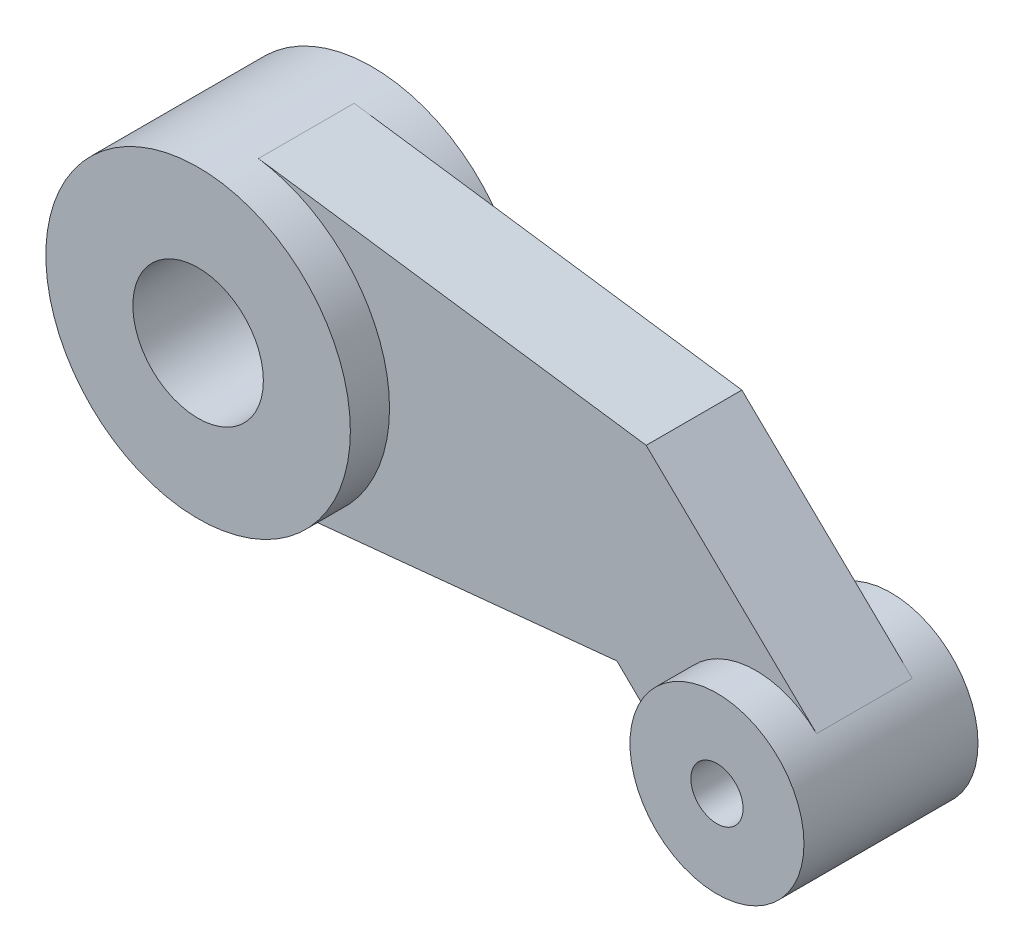
ISO-10303-21;
HEADER;
FILE_DESCRIPTION(('STEP AP214'),'2;1');
FILE_NAME('part.step','',(''),(''),'','','');
FILE_SCHEMA(('AUTOMOTIVE_DESIGN { 1 0 10303 214 1 1 1 1 }'));
ENDSEC;
DATA;
#1=APPLICATION_CONTEXT('core data for automotive mechanical design processes');
#2=APPLICATION_PROTOCOL_DEFINITION('international standard','automotive_design',2000,#1);
#3=PRODUCT_CONTEXT('',#1,'mechanical');
#4=PRODUCT('Part','Part','',(#3));
#5=PRODUCT_RELATED_PRODUCT_CATEGORY('part','',(#4));
#6=PRODUCT_DEFINITION_FORMATION('','',#4);
#7=PRODUCT_DEFINITION_CONTEXT('part definition',#1,'design');
#8=PRODUCT_DEFINITION('design','',#6,#7);
#9=PRODUCT_DEFINITION_SHAPE('','',#8);
#10=(LENGTH_UNIT() NAMED_UNIT(*) SI_UNIT(.MILLI.,.METRE.));
#11=(NAMED_UNIT(*) PLANE_ANGLE_UNIT() SI_UNIT($,.RADIAN.));
#12=(NAMED_UNIT(*) SI_UNIT($,.STERADIAN.) SOLID_ANGLE_UNIT());
#13=UNCERTAINTY_MEASURE_WITH_UNIT(LENGTH_MEASURE(1.E-05),#10,'distance_accuracy_value','');
#14=(GEOMETRIC_REPRESENTATION_CONTEXT(3) GLOBAL_UNCERTAINTY_ASSIGNED_CONTEXT((#13)) GLOBAL_UNIT_ASSIGNED_CONTEXT((#10,
#11,#12)) REPRESENTATION_CONTEXT('',''));
#15=CARTESIAN_POINT('',(0.,0.,0.));
#16=DIRECTION('',(0.,0.,1.));
#17=DIRECTION('',(1.,0.,0.));
#18=AXIS2_PLACEMENT_3D('',#15,#16,#17);
#19=CARTESIAN_POINT('',(15.239092250562,15.6204676908486,11.));
#20=DIRECTION('',(0.698314732770874,0.715790845146222,0.));
#21=DIRECTION('',(-0.715790845146222,0.698314732770874,0.));
#22=AXIS2_PLACEMENT_3D('',#19,#20,#21);
#23=PLANE('',#22);
#24=DIRECTION('',(0.715790845146222,-0.698314732770874,0.));
#25=VECTOR('',#24,1.);
#26=CARTESIAN_POINT('',(15.239092250562,15.6204676908486,0.));
#27=LINE('',#26,#25);
#28=CARTESIAN_POINT('',(43.6323840804154,-12.0795987896038,0.));
#29=VERTEX_POINT('',#28);
#30=CARTESIAN_POINT('',(50.2732587714625,-18.558335793143,0.));
#31=VERTEX_POINT('',#30);
#32=EDGE_CURVE('E126',#29,#31,#27,.T.);
#33=ORIENTED_EDGE('',*,*,#32,.T.);
#34=DIRECTION('',(0.,0.,-1.));
#35=VECTOR('',#34,1.);
#36=CARTESIAN_POINT('',(50.2732587714625,-18.558335793143,11.));
#37=LINE('',#36,#35);
#38=CARTESIAN_POINT('',(50.2732587714625,-18.558335793143,11.));
#39=VERTEX_POINT('',#38);
#40=EDGE_CURVE('E133',#39,#31,#37,.T.);
#41=ORIENTED_EDGE('',*,*,#40,.F.);
#42=DIRECTION('',(0.715790845146222,-0.698314732770874,0.));
#43=VECTOR('',#42,1.);
#44=CARTESIAN_POINT('',(15.239092250562,15.6204676908486,11.));
#45=LINE('',#44,#43);
#46=CARTESIAN_POINT('',(43.6323840804154,-12.0795987896038,11.));
#47=VERTEX_POINT('',#46);
#48=EDGE_CURVE('E109',#47,#39,#45,.T.);
#49=ORIENTED_EDGE('',*,*,#48,.F.);
#50=DIRECTION('',(0.,0.,-1.));
#51=VECTOR('',#50,1.);
#52=CARTESIAN_POINT('',(43.6323840804154,-12.0795987896038,11.));
#53=LINE('',#52,#51);
#54=EDGE_CURVE('E140',#47,#29,#53,.T.);
#55=ORIENTED_EDGE('',*,*,#54,.T.);
#56=EDGE_LOOP('',(#33,#41,#49,#55));
#57=FACE_BOUND('',#56,.T.);
#58=ADVANCED_FACE('F65',(#57),#23,.F.);
#59=CARTESIAN_POINT('',(59.6323840804154,-15.0360107866569,11.));
#60=DIRECTION('',(0.,0.,-1.));
#61=DIRECTION('',(-1.,0.,0.));
#62=AXIS2_PLACEMENT_3D('',#59,#60,#61);
#63=CYLINDRICAL_SURFACE('',#62,9.99999999999998);
#64=ORIENTED_EDGE('',*,*,#40,.T.);
#65=CARTESIAN_POINT('',(59.6323840804154,-15.0360107866569,0.));
#66=DIRECTION('',(0.,0.,1.));
#67=DIRECTION('',(1.,0.,0.));
#68=AXIS2_PLACEMENT_3D('',#65,#66,#67);
#69=CIRCLE('',#68,9.99999999999998);
#70=CARTESIAN_POINT('',(66.5789677850054,-7.84261278327041,0.));
#71=VERTEX_POINT('',#70);
#72=EDGE_CURVE('E12',#71,#31,#69,.T.);
#73=ORIENTED_EDGE('',*,*,#72,.F.);
#74=DIRECTION('',(0.,0.,-1.));
#75=VECTOR('',#74,1.);
#76=CARTESIAN_POINT('',(66.5789677850054,-7.84261278327041,11.));
#77=LINE('',#76,#75);
#78=CARTESIAN_POINT('',(66.5789677850054,-7.84261278327041,11.));
#79=VERTEX_POINT('',#78);
#80=EDGE_CURVE('E138',#79,#71,#77,.T.);
#81=ORIENTED_EDGE('',*,*,#80,.F.);
#82=CARTESIAN_POINT('',(59.6323840804154,-15.0360107866569,11.));
#83=DIRECTION('',(0.,0.,1.));
#84=DIRECTION('',(1.,0.,0.));
#85=AXIS2_PLACEMENT_3D('',#82,#83,#84);
#86=CIRCLE('',#85,9.99999999999998);
#87=EDGE_CURVE('E136',#79,#39,#86,.T.);
#88=ORIENTED_EDGE('',*,*,#87,.T.);
#89=EDGE_LOOP('',(#64,#73,#81,#88));
#90=FACE_BOUND('',#89,.T.);
#91=CARTESIAN_POINT('',(59.6323840804154,-15.0360107866569,-4.5));
#92=DIRECTION('',(0.,0.,1.));
#93=DIRECTION('',(1.,0.,0.));
#94=AXIS2_PLACEMENT_3D('',#91,#92,#93);
#95=CIRCLE('',#94,9.99999999999998);
#96=CARTESIAN_POINT('',(69.6323840804154,-15.0360107866569,-4.5));
#97=VERTEX_POINT('',#96);
#98=EDGE_CURVE('E377',#97,#97,#95,.T.);
#99=ORIENTED_EDGE('',*,*,#98,.T.);
#100=EDGE_LOOP('',(#99));
#101=FACE_BOUND('',#100,.T.);
#102=CARTESIAN_POINT('',(59.6323840804154,-15.0360107866569,15.5));
#103=DIRECTION('',(0.,0.,1.));
#104=DIRECTION('',(1.,0.,0.));
#105=AXIS2_PLACEMENT_3D('',#102,#103,#104);
#106=CIRCLE('',#105,9.99999999999998);
#107=CARTESIAN_POINT('',(69.6323840804154,-15.0360107866569,15.5));
#108=VERTEX_POINT('',#107);
#109=EDGE_CURVE('E173',#108,#108,#106,.T.);
#110=ORIENTED_EDGE('',*,*,#109,.F.);
#111=EDGE_LOOP('',(#110));
#112=FACE_BOUND('',#111,.T.);
#113=ADVANCED_FACE('F134',(#90,#101,#112),#63,.T.);
#114=CARTESIAN_POINT('',(28.2087800214369,29.2110468272476,11.));
#115=DIRECTION('',(0.694658370458999,0.71933980033865,0.));
#116=DIRECTION('',(-0.71933980033865,0.694658370458998,0.));
#117=AXIS2_PLACEMENT_3D('',#114,#115,#116);
#118=PLANE('',#117);
#119=DIRECTION('',(0.71933980033865,-0.694658370458998,0.));
#120=VECTOR('',#119,1.);
#121=CARTESIAN_POINT('',(28.2087800214369,29.2110468272476,0.));
#122=LINE('',#121,#120);
#123=CARTESIAN_POINT('',(46.9975923601718,11.0669016597745,0.));
#124=VERTEX_POINT('',#123);
#125=EDGE_CURVE('E128',#124,#71,#122,.T.);
#126=ORIENTED_EDGE('',*,*,#125,.F.);
#127=DIRECTION('',(0.,0.,-1.));
#128=VECTOR('',#127,1.);
#129=CARTESIAN_POINT('',(46.9975923601718,11.0669016597745,11.));
#130=LINE('',#129,#128);
#131=CARTESIAN_POINT('',(46.9975923601718,11.0669016597745,11.));
#132=VERTEX_POINT('',#131);
#133=EDGE_CURVE('E158',#132,#124,#130,.T.);
#134=ORIENTED_EDGE('',*,*,#133,.F.);
#135=DIRECTION('',(0.71933980033865,-0.694658370458998,0.));
#136=VECTOR('',#135,1.);
#137=CARTESIAN_POINT('',(28.2087800214369,29.2110468272476,11.));
#138=LINE('',#137,#136);
#139=EDGE_CURVE('E163',#132,#79,#138,.T.);
#140=ORIENTED_EDGE('',*,*,#139,.T.);
#141=ORIENTED_EDGE('',*,*,#80,.T.);
#142=EDGE_LOOP('',(#126,#134,#140,#141));
#143=FACE_BOUND('',#142,.T.);
#144=ADVANCED_FACE('F161',(#143),#118,.T.);
#145=CARTESIAN_POINT('',(2.43552926680115,17.3296912029775,11.));
#146=DIRECTION('',(0.139173100960066,0.99026806874157,0.));
#147=DIRECTION('',(-0.99026806874157,0.139173100960066,0.));
#148=AXIS2_PLACEMENT_3D('',#145,#146,#147);
#149=PLANE('',#148);
#150=DIRECTION('',(0.99026806874157,-0.139173100960066,0.));
#151=VECTOR('',#150,1.);
#152=CARTESIAN_POINT('',(2.43552926680115,17.3296912029775,0.));
#153=LINE('',#152,#151);
#154=CARTESIAN_POINT('',(2.43552926680115,17.3296912029775,0.));
#155=VERTEX_POINT('',#154);
#156=EDGE_CURVE('E143',#155,#124,#153,.T.);
#157=ORIENTED_EDGE('',*,*,#156,.F.);
#158=DIRECTION('',(0.,0.,-1.));
#159=VECTOR('',#158,1.);
#160=CARTESIAN_POINT('',(2.43552926680115,17.3296912029775,11.));
#161=LINE('',#160,#159);
#162=CARTESIAN_POINT('',(2.43552926680115,17.3296912029775,11.));
#163=VERTEX_POINT('',#162);
#164=EDGE_CURVE('E156',#163,#155,#161,.T.);
#165=ORIENTED_EDGE('',*,*,#164,.F.);
#166=DIRECTION('',(0.99026806874157,-0.139173100960066,0.));
#167=VECTOR('',#166,1.);
#168=CARTESIAN_POINT('',(2.43552926680115,17.3296912029775,11.));
#169=LINE('',#168,#167);
#170=EDGE_CURVE('E185',#163,#132,#169,.T.);
#171=ORIENTED_EDGE('',*,*,#170,.T.);
#172=ORIENTED_EDGE('',*,*,#133,.T.);
#173=EDGE_LOOP('',(#157,#165,#171,#172));
#174=FACE_BOUND('',#173,.T.);
#175=ADVANCED_FACE('F189',(#174),#149,.T.);
#176=CARTESIAN_POINT('',(0.,0.,11.));
#177=DIRECTION('',(0.,0.,-1.));
#178=DIRECTION('',(-1.,0.,0.));
#179=AXIS2_PLACEMENT_3D('',#176,#177,#178);
#180=CYLINDRICAL_SURFACE('',#179,17.5);
#181=ORIENTED_EDGE('',*,*,#164,.T.);
#182=CARTESIAN_POINT('',(0.,0.,0.));
#183=DIRECTION('',(0.,0.,1.));
#184=DIRECTION('',(1.,0.,0.));
#185=AXIS2_PLACEMENT_3D('',#182,#183,#184);
#186=CIRCLE('',#185,17.5);
#187=CARTESIAN_POINT('',(7.81088622934094,-15.6601422826324,0.));
#188=VERTEX_POINT('',#187);
#189=EDGE_CURVE('E73',#188,#155,#186,.T.);
#190=ORIENTED_EDGE('',*,*,#189,.F.);
#191=DIRECTION('',(0.,0.,-1.));
#192=VECTOR('',#191,1.);
#193=CARTESIAN_POINT('',(7.81088622934095,-15.6601422826324,11.));
#194=LINE('',#193,#192);
#195=CARTESIAN_POINT('',(7.81088622934095,-15.6601422826324,11.));
#196=VERTEX_POINT('',#195);
#197=EDGE_CURVE('E154',#196,#188,#194,.T.);
#198=ORIENTED_EDGE('',*,*,#197,.F.);
#199=CARTESIAN_POINT('',(0.,0.,11.));
#200=DIRECTION('',(0.,0.,1.));
#201=DIRECTION('',(1.,0.,0.));
#202=AXIS2_PLACEMENT_3D('',#199,#200,#201);
#203=CIRCLE('',#202,17.5);
#204=EDGE_CURVE('E141',#196,#163,#203,.T.);
#205=ORIENTED_EDGE('',*,*,#204,.T.);
#206=EDGE_LOOP('',(#181,#190,#198,#205));
#207=FACE_BOUND('',#206,.T.);
#208=CARTESIAN_POINT('',(0.,0.,-4.5));
#209=DIRECTION('',(0.,0.,1.));
#210=DIRECTION('',(1.,0.,0.));
#211=AXIS2_PLACEMENT_3D('',#208,#209,#210);
#212=CIRCLE('',#211,17.5);
#213=CARTESIAN_POINT('',(17.5,0.,-4.5));
#214=VERTEX_POINT('',#213);
#215=EDGE_CURVE('E146',#214,#214,#212,.T.);
#216=ORIENTED_EDGE('',*,*,#215,.T.);
#217=EDGE_LOOP('',(#216));
#218=FACE_BOUND('',#217,.T.);
#219=CARTESIAN_POINT('',(0.,0.,15.5));
#220=DIRECTION('',(0.,0.,1.));
#221=DIRECTION('',(1.,0.,0.));
#222=AXIS2_PLACEMENT_3D('',#219,#220,#221);
#223=CIRCLE('',#222,17.5);
#224=CARTESIAN_POINT('',(17.5,0.,15.5));
#225=VERTEX_POINT('',#224);
#226=EDGE_CURVE('E170',#225,#225,#223,.T.);
#227=ORIENTED_EDGE('',*,*,#226,.F.);
#228=EDGE_LOOP('',(#227));
#229=FACE_BOUND('',#228,.T.);
#230=ADVANCED_FACE('F192',(#207,#218,#229),#180,.T.);
#231=CARTESIAN_POINT('',(1.62709447474954,-16.2782441671823,11.));
#232=DIRECTION('',(-0.0994595414730178,0.99504160697429,0.));
#233=DIRECTION('',(-0.99504160697429,-0.0994595414730178,0.));
#234=AXIS2_PLACEMENT_3D('',#231,#232,#233);
#235=PLANE('',#234);
#236=DIRECTION('',(0.99504160697429,0.0994595414730178,0.));
#237=VECTOR('',#236,1.);
#238=CARTESIAN_POINT('',(1.62709447474954,-16.2782441671823,0.));
#239=LINE('',#238,#237);
#240=EDGE_CURVE('E104',#188,#29,#239,.T.);
#241=ORIENTED_EDGE('',*,*,#240,.T.);
#242=ORIENTED_EDGE('',*,*,#54,.F.);
#243=DIRECTION('',(0.99504160697429,0.0994595414730178,0.));
#244=VECTOR('',#243,1.);
#245=CARTESIAN_POINT('',(1.62709447474954,-16.2782441671823,11.));
#246=LINE('',#245,#244);
#247=EDGE_CURVE('E81',#196,#47,#246,.T.);
#248=ORIENTED_EDGE('',*,*,#247,.F.);
#249=ORIENTED_EDGE('',*,*,#197,.T.);
#250=EDGE_LOOP('',(#241,#242,#248,#249));
#251=FACE_BOUND('',#250,.T.);
#252=ADVANCED_FACE('F194',(#251),#235,.F.);
#253=CARTESIAN_POINT('',(0.,0.,11.));
#254=DIRECTION('',(0.,0.,1.));
#255=DIRECTION('',(1.,0.,0.));
#256=AXIS2_PLACEMENT_3D('',#253,#254,#255);
#257=PLANE('',#256);
#258=ORIENTED_EDGE('',*,*,#87,.F.);
#259=ORIENTED_EDGE('',*,*,#139,.F.);
#260=ORIENTED_EDGE('',*,*,#170,.F.);
#261=ORIENTED_EDGE('',*,*,#204,.F.);
#262=ORIENTED_EDGE('',*,*,#247,.T.);
#263=ORIENTED_EDGE('',*,*,#48,.T.);
#264=EDGE_LOOP('',(#258,#259,#260,#261,#262,#263));
#265=FACE_BOUND('',#264,.T.);
#266=ADVANCED_FACE('F164',(#265),#257,.T.);
#267=CARTESIAN_POINT('',(0.,0.,0.));
#268=DIRECTION('',(0.,0.,1.));
#269=DIRECTION('',(1.,0.,0.));
#270=AXIS2_PLACEMENT_3D('',#267,#268,#269);
#271=PLANE('',#270);
#272=ORIENTED_EDGE('',*,*,#125,.T.);
#273=ORIENTED_EDGE('',*,*,#72,.T.);
#274=ORIENTED_EDGE('',*,*,#32,.F.);
#275=ORIENTED_EDGE('',*,*,#240,.F.);
#276=ORIENTED_EDGE('',*,*,#189,.T.);
#277=ORIENTED_EDGE('',*,*,#156,.T.);
#278=EDGE_LOOP('',(#272,#273,#274,#275,#276,#277));
#279=FACE_BOUND('',#278,.T.);
#280=ADVANCED_FACE('F124',(#279),#271,.F.);
#281=CARTESIAN_POINT('',(0.,0.,-4.5));
#282=DIRECTION('',(0.,0.,1.));
#283=DIRECTION('',(1.,0.,0.));
#284=AXIS2_PLACEMENT_3D('',#281,#282,#283);
#285=PLANE('',#284);
#286=CARTESIAN_POINT('',(0.,0.,-4.5));
#287=DIRECTION('',(0.,0.,1.));
#288=DIRECTION('',(1.,0.,0.));
#289=AXIS2_PLACEMENT_3D('',#286,#287,#288);
#290=CIRCLE('',#289,7.5);
#291=CARTESIAN_POINT('',(7.5,0.,-4.5));
#292=VERTEX_POINT('',#291);
#293=EDGE_CURVE('E179',#292,#292,#290,.T.);
#294=ORIENTED_EDGE('',*,*,#293,.T.);
#295=EDGE_LOOP('',(#294));
#296=FACE_BOUND('',#295,.T.);
#297=ORIENTED_EDGE('',*,*,#215,.F.);
#298=EDGE_LOOP('',(#297));
#299=FACE_BOUND('',#298,.T.);
#300=ADVANCED_FACE('F249',(#296,#299),#285,.F.);
#301=CARTESIAN_POINT('',(0.,0.,11.));
#302=DIRECTION('',(0.,0.,-1.));
#303=DIRECTION('',(-1.,0.,0.));
#304=AXIS2_PLACEMENT_3D('',#301,#302,#303);
#305=CYLINDRICAL_SURFACE('',#304,7.5);
#306=ORIENTED_EDGE('',*,*,#293,.F.);
#307=EDGE_LOOP('',(#306));
#308=FACE_BOUND('',#307,.T.);
#309=CARTESIAN_POINT('',(0.,0.,15.5));
#310=DIRECTION('',(0.,0.,1.));
#311=DIRECTION('',(1.,0.,0.));
#312=AXIS2_PLACEMENT_3D('',#309,#310,#311);
#313=CIRCLE('',#312,7.5);
#314=CARTESIAN_POINT('',(7.5,0.,15.5));
#315=VERTEX_POINT('',#314);
#316=EDGE_CURVE('E166',#315,#315,#313,.T.);
#317=ORIENTED_EDGE('',*,*,#316,.T.);
#318=EDGE_LOOP('',(#317));
#319=FACE_BOUND('',#318,.T.);
#320=ADVANCED_FACE('F258',(#308,#319),#305,.F.);
#321=CARTESIAN_POINT('',(0.,0.,15.5));
#322=DIRECTION('',(0.,0.,1.));
#323=DIRECTION('',(1.,0.,0.));
#324=AXIS2_PLACEMENT_3D('',#321,#322,#323);
#325=PLANE('',#324);
#326=ORIENTED_EDGE('',*,*,#226,.T.);
#327=EDGE_LOOP('',(#326));
#328=FACE_BOUND('',#327,.T.);
#329=ORIENTED_EDGE('',*,*,#316,.F.);
#330=EDGE_LOOP('',(#329));
#331=FACE_BOUND('',#330,.T.);
#332=ADVANCED_FACE('F269',(#328,#331),#325,.T.);
#333=CARTESIAN_POINT('',(59.6323840804154,-15.0360107866569,-4.5));
#334=DIRECTION('',(0.,0.,1.));
#335=DIRECTION('',(1.,0.,0.));
#336=AXIS2_PLACEMENT_3D('',#333,#334,#335);
#337=PLANE('',#336);
#338=CARTESIAN_POINT('',(59.6323840804154,-15.0360107866569,-4.5));
#339=DIRECTION('',(0.,0.,1.));
#340=DIRECTION('',(1.,0.,0.));
#341=AXIS2_PLACEMENT_3D('',#338,#339,#340);
#342=CIRCLE('',#341,3.00000000000001);
#343=CARTESIAN_POINT('',(62.6323840804154,-15.0360107866569,-4.5));
#344=VERTEX_POINT('',#343);
#345=EDGE_CURVE('E375',#344,#344,#342,.T.);
#346=ORIENTED_EDGE('',*,*,#345,.T.);
#347=EDGE_LOOP('',(#346));
#348=FACE_BOUND('',#347,.T.);
#349=ORIENTED_EDGE('',*,*,#98,.F.);
#350=EDGE_LOOP('',(#349));
#351=FACE_BOUND('',#350,.T.);
#352=ADVANCED_FACE('F278',(#348,#351),#337,.F.);
#353=CARTESIAN_POINT('',(59.6323840804154,-15.0360107866569,11.));
#354=DIRECTION('',(0.,0.,-1.));
#355=DIRECTION('',(-1.,0.,0.));
#356=AXIS2_PLACEMENT_3D('',#353,#354,#355);
#357=CYLINDRICAL_SURFACE('',#356,3.00000000000001);
#358=ORIENTED_EDGE('',*,*,#345,.F.);
#359=EDGE_LOOP('',(#358));
#360=FACE_BOUND('',#359,.T.);
#361=CARTESIAN_POINT('',(59.6323840804154,-15.0360107866569,15.5));
#362=DIRECTION('',(0.,0.,1.));
#363=DIRECTION('',(1.,0.,0.));
#364=AXIS2_PLACEMENT_3D('',#361,#362,#363);
#365=CIRCLE('',#364,3.00000000000001);
#366=CARTESIAN_POINT('',(62.6323840804154,-15.0360107866569,15.5));
#367=VERTEX_POINT('',#366);
#368=EDGE_CURVE('E167',#367,#367,#365,.T.);
#369=ORIENTED_EDGE('',*,*,#368,.T.);
#370=EDGE_LOOP('',(#369));
#371=FACE_BOUND('',#370,.T.);
#372=ADVANCED_FACE('F289',(#360,#371),#357,.F.);
#373=CARTESIAN_POINT('',(59.6323840804154,-15.0360107866569,15.5));
#374=DIRECTION('',(0.,0.,1.));
#375=DIRECTION('',(1.,0.,0.));
#376=AXIS2_PLACEMENT_3D('',#373,#374,#375);
#377=PLANE('',#376);
#378=ORIENTED_EDGE('',*,*,#109,.T.);
#379=EDGE_LOOP('',(#378));
#380=FACE_BOUND('',#379,.T.);
#381=ORIENTED_EDGE('',*,*,#368,.F.);
#382=EDGE_LOOP('',(#381));
#383=FACE_BOUND('',#382,.T.);
#384=ADVANCED_FACE('F300',(#380,#383),#377,.T.);
#385=CLOSED_SHELL('',(#58,#113,#144,#175,#230,#252,#266,#280,#300,#320,#332,#352,#372,#384));
#386=MANIFOLD_SOLID_BREP('B2',#385);
#387=ADVANCED_BREP_SHAPE_REPRESENTATION('',(#18,#386),#14);
#388=SHAPE_DEFINITION_REPRESENTATION(#9,#387);
ENDSEC;
END-ISO-10303-21;
